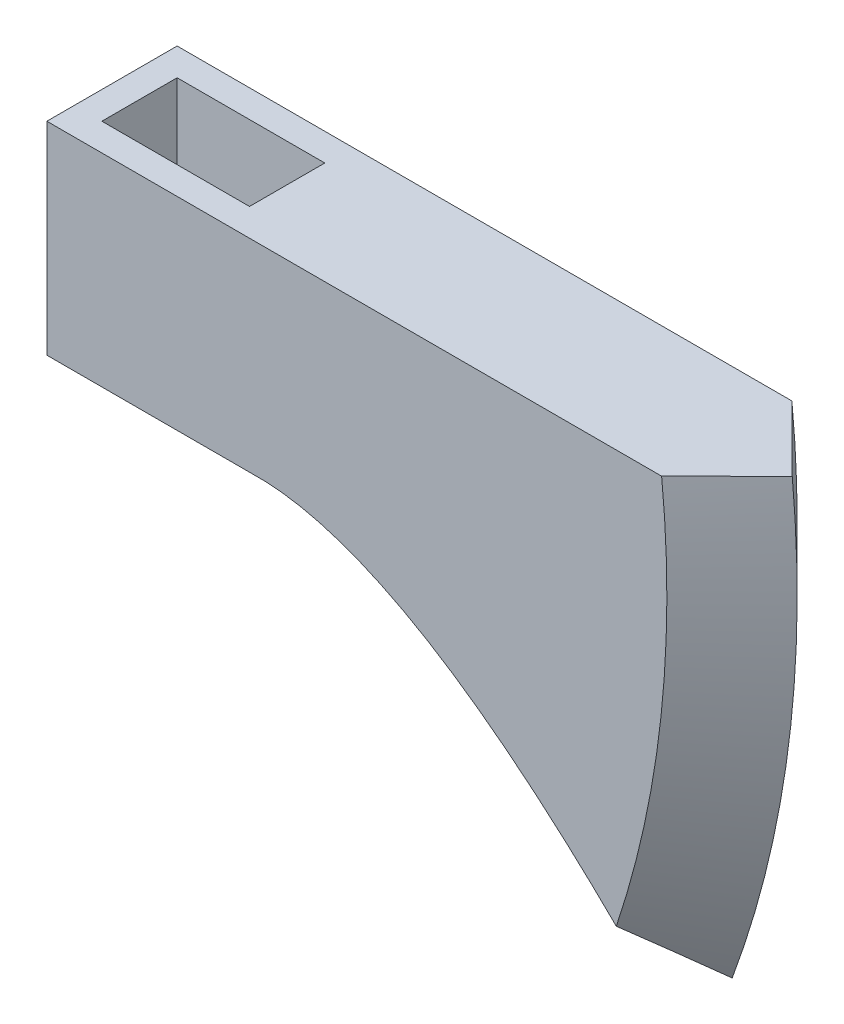
ISO-10303-21;
HEADER;
FILE_DESCRIPTION(('STEP AP214'),'2;1');
FILE_NAME('part.step','',(''),(''),'','','');
FILE_SCHEMA(('AUTOMOTIVE_DESIGN { 1 0 10303 214 1 1 1 1 }'));
ENDSEC;
DATA;
#1=APPLICATION_CONTEXT('core data for automotive mechanical design processes');
#2=APPLICATION_PROTOCOL_DEFINITION('international standard','automotive_design',2000,#1);
#3=PRODUCT_CONTEXT('',#1,'mechanical');
#4=PRODUCT('Part','Part','',(#3));
#5=PRODUCT_RELATED_PRODUCT_CATEGORY('part','',(#4));
#6=PRODUCT_DEFINITION_FORMATION('','',#4);
#7=PRODUCT_DEFINITION_CONTEXT('part definition',#1,'design');
#8=PRODUCT_DEFINITION('design','',#6,#7);
#9=PRODUCT_DEFINITION_SHAPE('','',#8);
#10=(LENGTH_UNIT() NAMED_UNIT(*) SI_UNIT(.MILLI.,.METRE.));
#11=(NAMED_UNIT(*) PLANE_ANGLE_UNIT() SI_UNIT($,.RADIAN.));
#12=(NAMED_UNIT(*) SI_UNIT($,.STERADIAN.) SOLID_ANGLE_UNIT());
#13=UNCERTAINTY_MEASURE_WITH_UNIT(LENGTH_MEASURE(1.E-05),#10,'distance_accuracy_value','');
#14=(GEOMETRIC_REPRESENTATION_CONTEXT(3) GLOBAL_UNCERTAINTY_ASSIGNED_CONTEXT((#13)) GLOBAL_UNIT_ASSIGNED_CONTEXT((#10,
#11,#12)) REPRESENTATION_CONTEXT('',''));
#15=CARTESIAN_POINT('',(0.,0.,0.));
#16=DIRECTION('',(0.,0.,1.));
#17=DIRECTION('',(1.,0.,0.));
#18=AXIS2_PLACEMENT_3D('',#15,#16,#17);
#19=CARTESIAN_POINT('',(-34.1369863013698,-14.,9.));
#20=DIRECTION('',(1.,0.,0.));
#21=DIRECTION('',(0.,1.,0.));
#22=AXIS2_PLACEMENT_3D('',#19,#20,#21);
#23=PLANE('',#22);
#24=DIRECTION('',(0.,-1.,0.));
#25=VECTOR('',#24,1.);
#26=CARTESIAN_POINT('',(-34.1369863013698,-14.,0.));
#27=LINE('',#26,#25);
#28=CARTESIAN_POINT('',(-34.1369863013698,-14.,0.));
#29=VERTEX_POINT('',#28);
#30=CARTESIAN_POINT('',(-34.1369863013698,-28.,0.));
#31=VERTEX_POINT('',#30);
#32=EDGE_CURVE('E188',#29,#31,#27,.T.);
#33=ORIENTED_EDGE('',*,*,#32,.T.);
#34=DIRECTION('',(0.,0.,-1.));
#35=VECTOR('',#34,1.);
#36=CARTESIAN_POINT('',(-34.1369863013698,-28.,9.));
#37=LINE('',#36,#35);
#38=CARTESIAN_POINT('',(-34.1369863013698,-28.,9.));
#39=VERTEX_POINT('',#38);
#40=EDGE_CURVE('E208',#39,#31,#37,.T.);
#41=ORIENTED_EDGE('',*,*,#40,.F.);
#42=DIRECTION('',(0.,-1.,0.));
#43=VECTOR('',#42,1.);
#44=CARTESIAN_POINT('',(-34.1369863013698,-14.,9.));
#45=LINE('',#44,#43);
#46=CARTESIAN_POINT('',(-34.1369863013698,-14.,9.));
#47=VERTEX_POINT('',#46);
#48=EDGE_CURVE('E216',#47,#39,#45,.T.);
#49=ORIENTED_EDGE('',*,*,#48,.F.);
#50=DIRECTION('',(0.,0.,-1.));
#51=VECTOR('',#50,1.);
#52=CARTESIAN_POINT('',(-34.1369863013698,-14.,9.));
#53=LINE('',#52,#51);
#54=EDGE_CURVE('E128',#47,#29,#53,.T.);
#55=ORIENTED_EDGE('',*,*,#54,.T.);
#56=EDGE_LOOP('',(#33,#41,#49,#55));
#57=FACE_BOUND('',#56,.T.);
#58=ADVANCED_FACE('F40',(#57),#23,.F.);
#59=CARTESIAN_POINT('',(-34.1369863013698,-28.,9.));
#60=DIRECTION('',(0.,1.,0.));
#61=DIRECTION('',(0.,0.,1.));
#62=AXIS2_PLACEMENT_3D('',#59,#60,#61);
#63=PLANE('',#62);
#64=DIRECTION('',(-1.,0.,0.));
#65=VECTOR('',#64,1.);
#66=CARTESIAN_POINT('',(-34.1369863013698,-28.,1.9));
#67=LINE('',#66,#65);
#68=CARTESIAN_POINT('',(-22.0369863013698,-28.,1.9));
#69=VERTEX_POINT('',#68);
#70=CARTESIAN_POINT('',(-32.2369863013698,-28.,1.9));
#71=VERTEX_POINT('',#70);
#72=EDGE_CURVE('E261',#69,#71,#67,.T.);
#73=ORIENTED_EDGE('',*,*,#72,.T.);
#74=DIRECTION('',(0.,0.,1.));
#75=VECTOR('',#74,1.);
#76=CARTESIAN_POINT('',(-32.2369863013698,-28.,9.));
#77=LINE('',#76,#75);
#78=CARTESIAN_POINT('',(-32.2369863013698,-28.,7.1));
#79=VERTEX_POINT('',#78);
#80=EDGE_CURVE('E194',#71,#79,#77,.T.);
#81=ORIENTED_EDGE('',*,*,#80,.T.);
#82=DIRECTION('',(1.,0.,0.));
#83=VECTOR('',#82,1.);
#84=CARTESIAN_POINT('',(-34.1369863013698,-28.,7.1));
#85=LINE('',#84,#83);
#86=CARTESIAN_POINT('',(-22.0369863013698,-28.,7.1));
#87=VERTEX_POINT('',#86);
#88=EDGE_CURVE('E266',#79,#87,#85,.T.);
#89=ORIENTED_EDGE('',*,*,#88,.T.);
#90=DIRECTION('',(0.,0.,-1.));
#91=VECTOR('',#90,1.);
#92=CARTESIAN_POINT('',(-22.0369863013698,-28.,9.));
#93=LINE('',#92,#91);
#94=EDGE_CURVE('E135',#87,#69,#93,.T.);
#95=ORIENTED_EDGE('',*,*,#94,.T.);
#96=EDGE_LOOP('',(#73,#81,#89,#95));
#97=FACE_BOUND('',#96,.T.);
#98=DIRECTION('',(1.,0.,0.));
#99=VECTOR('',#98,1.);
#100=CARTESIAN_POINT('',(-34.1369863013698,-28.,0.));
#101=LINE('',#100,#99);
#102=CARTESIAN_POINT('',(-20.1369863013698,-28.,0.));
#103=VERTEX_POINT('',#102);
#104=EDGE_CURVE('E193',#31,#103,#101,.T.);
#105=ORIENTED_EDGE('',*,*,#104,.T.);
#106=DIRECTION('',(0.,0.,-1.));
#107=VECTOR('',#106,1.);
#108=CARTESIAN_POINT('',(-20.1369863013698,-28.,9.));
#109=LINE('',#108,#107);
#110=CARTESIAN_POINT('',(-20.1369863013698,-28.,9.));
#111=VERTEX_POINT('',#110);
#112=EDGE_CURVE('E185',#111,#103,#109,.T.);
#113=ORIENTED_EDGE('',*,*,#112,.F.);
#114=DIRECTION('',(1.,0.,0.));
#115=VECTOR('',#114,1.);
#116=CARTESIAN_POINT('',(-34.1369863013698,-28.,9.));
#117=LINE('',#116,#115);
#118=EDGE_CURVE('E186',#39,#111,#117,.T.);
#119=ORIENTED_EDGE('',*,*,#118,.F.);
#120=ORIENTED_EDGE('',*,*,#40,.T.);
#121=EDGE_LOOP('',(#105,#113,#119,#120));
#122=FACE_BOUND('',#121,.T.);
#123=ADVANCED_FACE('F175',(#97,#122),#63,.F.);
#124=CARTESIAN_POINT('',(-20.1369863013698,-28.,9.));
#125=CARTESIAN_POINT('',(-8.57754467754687,-27.5827571257103,9.));
#126=CARTESIAN_POINT('',(9.09151862111341,-46.4948701036733,9.));
#127=B_SPLINE_CURVE_WITH_KNOTS('',2,(#124,#125,#126),.UNSPECIFIED.,.F.,.F.,(3,3),(0.,1.),.UNSPECIFIED.);
#128=DIRECTION('',(0.,0.,-1.));
#129=VECTOR('',#128,1.);
#130=SURFACE_OF_LINEAR_EXTRUSION('',#127,#129);
#131=CARTESIAN_POINT('',(-20.1369863013698,-28.,0.));
#132=CARTESIAN_POINT('',(-8.57754467754687,-27.5827571257103,0.));
#133=CARTESIAN_POINT('',(9.09151862111341,-46.4948701036733,0.));
#134=B_SPLINE_CURVE_WITH_KNOTS('',2,(#131,#132,#133),.UNSPECIFIED.,.F.,.F.,(3,3),(0.,1.),.UNSPECIFIED.);
#135=CARTESIAN_POINT('',(5.20330146390259,-42.494136438475,0.));
#136=VERTEX_POINT('',#135);
#137=EDGE_CURVE('E196',#103,#136,#134,.T.);
#138=ORIENTED_EDGE('',*,*,#137,.T.);
#139=CARTESIAN_POINT('',(5.20330146390272,-42.4941364384748,0.));
#140=CARTESIAN_POINT('',(5.36872680943576,-42.6572218572216,0.20855075810476));
#141=CARTESIAN_POINT('',(5.53370221831308,-42.8208095757631,0.417065326718535));
#142=CARTESIAN_POINT('',(5.86276399961041,-43.1489429115123,0.834020679713435));
#143=CARTESIAN_POINT('',(6.02685041278599,-43.3134884840778,1.04246146706046));
#144=CARTESIAN_POINT('',(6.35415559673947,-43.6435011392242,1.45928110383902));
#145=CARTESIAN_POINT('',(6.51737439249722,-43.8089681949905,1.6676599548889));
#146=CARTESIAN_POINT('',(6.84296477768484,-44.1407898213802,2.08436663882076));
#147=CARTESIAN_POINT('',(7.00533637829413,-44.3071443802333,2.2926944723412));
#148=CARTESIAN_POINT('',(7.32925135743088,-44.6407078225895,2.70930841482869));
#149=CARTESIAN_POINT('',(7.49079473873783,-44.8079167032217,2.9175945239335));
#150=CARTESIAN_POINT('',(7.81307325056096,-45.1431590449371,3.33413583186656));
#151=CARTESIAN_POINT('',(7.97380836817467,-45.3111925190994,3.5423910301502));
#152=CARTESIAN_POINT('',(8.29448890616631,-45.6480549337294,3.95887975490476));
#153=CARTESIAN_POINT('',(8.45443430318623,-45.8168838974406,4.16711328055844));
#154=CARTESIAN_POINT('',(8.77355316179401,-46.1553099754242,4.58356718531641));
#155=CARTESIAN_POINT('',(8.93272659087685,-46.3249071214708,4.79178756350893));
#156=CARTESIAN_POINT('',(9.09151862111341,-46.4948701036733,5.));
#157=B_SPLINE_CURVE_WITH_KNOTS('',3,(#139,#140,#141,#142,#143,#144,#145,#146,#147,#148,#149,
#150,#151,#152,#153,#154,#155,#156),.UNSPECIFIED.,.F.,.F.,(4,2,2,2,2,2,2,2,4),(0.,
0.936536415336516,1.8730295260025,2.80949552614946,3.7459491374599,4.68239960398278,
5.61886497209713,6.55535787460602,7.49188987320832),.UNSPECIFIED.);
#158=CARTESIAN_POINT('',(8.70947212242241,-46.087446479258,4.50000000000881));
#159=VERTEX_POINT('',#158);
#160=EDGE_CURVE('E51',#136,#159,#157,.T.);
#161=ORIENTED_EDGE('',*,*,#160,.T.);
#162=CARTESIAN_POINT('',(9.09151862111341,-46.4948701036733,3.99999999999999));
#163=CARTESIAN_POINT('',(8.93272659087685,-46.3249071214708,4.20821243649105));
#164=CARTESIAN_POINT('',(8.77355316179401,-46.1553099754242,4.41643281468358));
#165=CARTESIAN_POINT('',(8.45443430318624,-45.8168838974406,4.83288671944155));
#166=CARTESIAN_POINT('',(8.29448890616631,-45.6480549337294,5.04112024509523));
#167=CARTESIAN_POINT('',(7.97380836817467,-45.3111925190994,5.45760896984979));
#168=CARTESIAN_POINT('',(7.81307325056096,-45.1431590449371,5.66586416813342));
#169=CARTESIAN_POINT('',(7.49079473873783,-44.8079167032217,6.08240547606649));
#170=CARTESIAN_POINT('',(7.32925135743088,-44.6407078225895,6.29069158517131));
#171=CARTESIAN_POINT('',(7.00533637829414,-44.3071443802333,6.70730552765879));
#172=CARTESIAN_POINT('',(6.84296477768484,-44.1407898213802,6.91563336117922));
#173=CARTESIAN_POINT('',(6.51737439249721,-43.8089681949905,7.33234004511107));
#174=CARTESIAN_POINT('',(6.35415559673947,-43.6435011392242,7.54071889616096));
#175=CARTESIAN_POINT('',(6.026850412786,-43.3134884840777,7.95753853293952));
#176=CARTESIAN_POINT('',(5.86276399961042,-43.1489429115123,8.16597932028654));
#177=CARTESIAN_POINT('',(5.53370221831307,-42.8208095757632,8.58293467328145));
#178=CARTESIAN_POINT('',(5.36872680943571,-42.6572218572217,8.79144924189524));
#179=CARTESIAN_POINT('',(5.20330146390259,-42.494136438475,9.00000000000004));
#180=B_SPLINE_CURVE_WITH_KNOTS('',3,(#162,#163,#164,#165,#166,#167,#168,#169,#170,#171,#172,
#173,#174,#175,#176,#177,#178,#179),.UNSPECIFIED.,.F.,.F.,(4,2,2,2,2,2,2,2,4),(0.,
0.936531998602297,1.87302490111118,2.80949026922554,3.74594073574841,4.68239434705886,
5.61886034720581,6.55535345787179,7.49188987320831),.UNSPECIFIED.);
#181=CARTESIAN_POINT('',(5.2033014639026,-42.494136438475,9.));
#182=VERTEX_POINT('',#181);
#183=EDGE_CURVE('E61',#159,#182,#180,.T.);
#184=ORIENTED_EDGE('',*,*,#183,.T.);
#185=EDGE_CURVE('E179',#111,#182,#127,.T.);
#186=ORIENTED_EDGE('',*,*,#185,.F.);
#187=ORIENTED_EDGE('',*,*,#112,.T.);
#188=EDGE_LOOP('',(#138,#161,#184,#186,#187));
#189=FACE_BOUND('',#188,.T.);
#190=ADVANCED_FACE('F167',(#189),#130,.F.);
#191=CARTESIAN_POINT('',(-20.1369863013698,-14.,9.));
#192=DIRECTION('',(0.,-1.,0.));
#193=DIRECTION('',(0.,0.,-1.));
#194=AXIS2_PLACEMENT_3D('',#191,#192,#193);
#195=PLANE('',#194);
#196=DIRECTION('',(-1.,0.,0.));
#197=VECTOR('',#196,1.);
#198=CARTESIAN_POINT('',(-20.1369863013698,-14.,7.1));
#199=LINE('',#198,#197);
#200=CARTESIAN_POINT('',(-22.0369863013698,-14.,7.1));
#201=VERTEX_POINT('',#200);
#202=CARTESIAN_POINT('',(-32.2369863013698,-14.,7.1));
#203=VERTEX_POINT('',#202);
#204=EDGE_CURVE('E116',#201,#203,#199,.T.);
#205=ORIENTED_EDGE('',*,*,#204,.T.);
#206=DIRECTION('',(0.,0.,-1.));
#207=VECTOR('',#206,1.);
#208=CARTESIAN_POINT('',(-32.2369863013698,-14.,9.));
#209=LINE('',#208,#207);
#210=CARTESIAN_POINT('',(-32.2369863013698,-14.,1.9));
#211=VERTEX_POINT('',#210);
#212=EDGE_CURVE('E144',#203,#211,#209,.T.);
#213=ORIENTED_EDGE('',*,*,#212,.T.);
#214=DIRECTION('',(1.,0.,0.));
#215=VECTOR('',#214,1.);
#216=CARTESIAN_POINT('',(-20.1369863013698,-14.,1.9));
#217=LINE('',#216,#215);
#218=CARTESIAN_POINT('',(-22.0369863013698,-14.,1.9));
#219=VERTEX_POINT('',#218);
#220=EDGE_CURVE('E142',#211,#219,#217,.T.);
#221=ORIENTED_EDGE('',*,*,#220,.T.);
#222=DIRECTION('',(0.,0.,1.));
#223=VECTOR('',#222,1.);
#224=CARTESIAN_POINT('',(-22.0369863013698,-14.,9.));
#225=LINE('',#224,#223);
#226=EDGE_CURVE('E127',#219,#201,#225,.T.);
#227=ORIENTED_EDGE('',*,*,#226,.T.);
#228=EDGE_LOOP('',(#205,#213,#221,#227));
#229=FACE_BOUND('',#228,.T.);
#230=CARTESIAN_POINT('',(8.33403323451083,-14.,9.));
#231=CARTESIAN_POINT('',(9.17167185692276,-14.,8.16681543099034));
#232=CARTESIAN_POINT('',(10.0092364662861,-14.,7.33355647970208));
#233=CARTESIAN_POINT('',(11.6842176584464,-14.,5.66688981303532));
#234=CARTESIAN_POINT('',(12.5216342412434,-14.,4.83348209765691));
#235=CARTESIAN_POINT('',(13.3589768109919,-14.,3.99999999999999));
#236=B_SPLINE_CURVE_WITH_KNOTS('',3,(#230,#231,#232,#233,#234,#235),.UNSPECIFIED.,.F.,.F.,(4,2,
4),(0.,3.544363778288,7.08872755458989),.UNSPECIFIED.);
#237=CARTESIAN_POINT('',(8.33403323451083,-14.,9.));
#238=VERTEX_POINT('',#237);
#239=CARTESIAN_POINT('',(12.8566386385213,-14.,4.50000000000001));
#240=VERTEX_POINT('',#239);
#241=EDGE_CURVE('E149',#238,#240,#236,.T.);
#242=ORIENTED_EDGE('',*,*,#241,.T.);
#243=CARTESIAN_POINT('',(13.3589768109919,-14.,5.));
#244=CARTESIAN_POINT('',(12.5216342412434,-14.,4.16651790234308));
#245=CARTESIAN_POINT('',(11.6842176584464,-14.,3.33311018696467));
#246=CARTESIAN_POINT('',(10.0092364662861,-14.,1.66644352029792));
#247=CARTESIAN_POINT('',(9.17167185692277,-14.,0.833184569009659));
#248=CARTESIAN_POINT('',(8.33403323451085,-14.,0.));
#249=B_SPLINE_CURVE_WITH_KNOTS('',3,(#243,#244,#245,#246,#247,#248),.UNSPECIFIED.,.F.,.F.,(4,2,
4),(0.,3.54436377630188,7.08872755458987),.UNSPECIFIED.);
#250=CARTESIAN_POINT('',(8.33403323451085,-14.,0.));
#251=VERTEX_POINT('',#250);
#252=EDGE_CURVE('E156',#240,#251,#249,.T.);
#253=ORIENTED_EDGE('',*,*,#252,.T.);
#254=DIRECTION('',(-1.,0.,0.));
#255=VECTOR('',#254,1.);
#256=CARTESIAN_POINT('',(-20.1369863013698,-14.,0.));
#257=LINE('',#256,#255);
#258=EDGE_CURVE('E200',#251,#29,#257,.T.);
#259=ORIENTED_EDGE('',*,*,#258,.T.);
#260=ORIENTED_EDGE('',*,*,#54,.F.);
#261=DIRECTION('',(-1.,0.,0.));
#262=VECTOR('',#261,1.);
#263=CARTESIAN_POINT('',(-34.1369863013698,-14.,9.));
#264=LINE('',#263,#262);
#265=EDGE_CURVE('E205',#238,#47,#264,.T.);
#266=ORIENTED_EDGE('',*,*,#265,.F.);
#267=EDGE_LOOP('',(#242,#253,#259,#260,#266));
#268=FACE_BOUND('',#267,.T.);
#269=ADVANCED_FACE('F140',(#229,#268),#195,.F.);
#270=CARTESIAN_POINT('',(-59.1900176319002,-21.,9.));
#271=DIRECTION('',(0.,0.,-1.));
#272=DIRECTION('',(-1.,0.,0.));
#273=AXIS2_PLACEMENT_3D('',#270,#271,#272);
#274=PLANE('',#273);
#275=ORIENTED_EDGE('',*,*,#185,.T.);
#276=CARTESIAN_POINT('',(-59.1900176319002,-21.,9.));
#277=DIRECTION('',(0.,0.,-1.));
#278=DIRECTION('',(-1.,0.,0.));
#279=AXIS2_PLACEMENT_3D('',#276,#277,#278);
#280=CIRCLE('',#279,67.8859149265123);
#281=EDGE_CURVE('E11',#182,#238,#280,.F.);
#282=ORIENTED_EDGE('',*,*,#281,.T.);
#283=ORIENTED_EDGE('',*,*,#265,.T.);
#284=ORIENTED_EDGE('',*,*,#48,.T.);
#285=ORIENTED_EDGE('',*,*,#118,.T.);
#286=EDGE_LOOP('',(#275,#282,#283,#284,#285));
#287=FACE_BOUND('',#286,.T.);
#288=ADVANCED_FACE('F166',(#287),#274,.F.);
#289=CARTESIAN_POINT('',(-59.1900176319002,-21.,0.));
#290=DIRECTION('',(0.,0.,-1.));
#291=DIRECTION('',(-1.,0.,0.));
#292=AXIS2_PLACEMENT_3D('',#289,#290,#291);
#293=PLANE('',#292);
#294=ORIENTED_EDGE('',*,*,#258,.F.);
#295=CARTESIAN_POINT('',(-59.1900176319002,-21.,0.));
#296=DIRECTION('',(0.,0.,-1.));
#297=DIRECTION('',(-1.,0.,0.));
#298=AXIS2_PLACEMENT_3D('',#295,#296,#297);
#299=CIRCLE('',#298,67.8859149265123);
#300=EDGE_CURVE('E236',#251,#136,#299,.T.);
#301=ORIENTED_EDGE('',*,*,#300,.T.);
#302=ORIENTED_EDGE('',*,*,#137,.F.);
#303=ORIENTED_EDGE('',*,*,#104,.F.);
#304=ORIENTED_EDGE('',*,*,#32,.F.);
#305=EDGE_LOOP('',(#294,#301,#302,#303,#304));
#306=FACE_BOUND('',#305,.T.);
#307=ADVANCED_FACE('F168',(#306),#293,.T.);
#308=CARTESIAN_POINT('',(-32.2369863013698,-46.4948701036733,1.9));
#309=DIRECTION('',(-1.,0.,0.));
#310=DIRECTION('',(0.,0.,1.));
#311=AXIS2_PLACEMENT_3D('',#308,#309,#310);
#312=PLANE('',#311);
#313=DIRECTION('',(0.,1.,0.));
#314=VECTOR('',#313,1.);
#315=CARTESIAN_POINT('',(-32.2369863013698,-46.4948701036733,1.9));
#316=LINE('',#315,#314);
#317=EDGE_CURVE('E271',#71,#211,#316,.T.);
#318=ORIENTED_EDGE('',*,*,#317,.T.);
#319=ORIENTED_EDGE('',*,*,#212,.F.);
#320=DIRECTION('',(0.,1.,0.));
#321=VECTOR('',#320,1.);
#322=CARTESIAN_POINT('',(-32.2369863013698,-46.4948701036733,7.1));
#323=LINE('',#322,#321);
#324=EDGE_CURVE('E122',#79,#203,#323,.T.);
#325=ORIENTED_EDGE('',*,*,#324,.F.);
#326=ORIENTED_EDGE('',*,*,#80,.F.);
#327=EDGE_LOOP('',(#318,#319,#325,#326));
#328=FACE_BOUND('',#327,.T.);
#329=ADVANCED_FACE('F276',(#328),#312,.F.);
#330=CARTESIAN_POINT('',(-32.2369863013698,-46.4948701036733,1.9));
#331=DIRECTION('',(0.,0.,-1.));
#332=DIRECTION('',(-1.,0.,0.));
#333=AXIS2_PLACEMENT_3D('',#330,#331,#332);
#334=PLANE('',#333);
#335=DIRECTION('',(0.,1.,0.));
#336=VECTOR('',#335,1.);
#337=CARTESIAN_POINT('',(-22.0369863013698,-46.4948701036733,1.9));
#338=LINE('',#337,#336);
#339=EDGE_CURVE('E137',#69,#219,#338,.T.);
#340=ORIENTED_EDGE('',*,*,#339,.T.);
#341=ORIENTED_EDGE('',*,*,#220,.F.);
#342=ORIENTED_EDGE('',*,*,#317,.F.);
#343=ORIENTED_EDGE('',*,*,#72,.F.);
#344=EDGE_LOOP('',(#340,#341,#342,#343));
#345=FACE_BOUND('',#344,.T.);
#346=ADVANCED_FACE('F277',(#345),#334,.F.);
#347=CARTESIAN_POINT('',(-22.0369863013698,-46.4948701036733,1.9));
#348=DIRECTION('',(1.,0.,0.));
#349=DIRECTION('',(0.,0.,-1.));
#350=AXIS2_PLACEMENT_3D('',#347,#348,#349);
#351=PLANE('',#350);
#352=DIRECTION('',(0.,1.,0.));
#353=VECTOR('',#352,1.);
#354=CARTESIAN_POINT('',(-22.0369863013698,-46.4948701036733,7.1));
#355=LINE('',#354,#353);
#356=EDGE_CURVE('E119',#87,#201,#355,.T.);
#357=ORIENTED_EDGE('',*,*,#356,.T.);
#358=ORIENTED_EDGE('',*,*,#226,.F.);
#359=ORIENTED_EDGE('',*,*,#339,.F.);
#360=ORIENTED_EDGE('',*,*,#94,.F.);
#361=EDGE_LOOP('',(#357,#358,#359,#360));
#362=FACE_BOUND('',#361,.T.);
#363=ADVANCED_FACE('F131',(#362),#351,.F.);
#364=CARTESIAN_POINT('',(-32.2369863013698,-46.4948701036733,7.1));
#365=DIRECTION('',(0.,0.,1.));
#366=DIRECTION('',(1.,0.,0.));
#367=AXIS2_PLACEMENT_3D('',#364,#365,#366);
#368=PLANE('',#367);
#369=ORIENTED_EDGE('',*,*,#324,.T.);
#370=ORIENTED_EDGE('',*,*,#204,.F.);
#371=ORIENTED_EDGE('',*,*,#356,.F.);
#372=ORIENTED_EDGE('',*,*,#88,.F.);
#373=EDGE_LOOP('',(#369,#370,#371,#372));
#374=FACE_BOUND('',#373,.T.);
#375=ADVANCED_FACE('F118',(#374),#368,.F.);
#376=CARTESIAN_POINT('',(-59.1900176319002,-21.,9.));
#377=DIRECTION('',(0.,0.,-1.));
#378=DIRECTION('',(-1.,0.,0.));
#379=AXIS2_PLACEMENT_3D('',#376,#377,#378);
#380=CONICAL_SURFACE('',#379,67.8859149265123,0.785398163397448);
#381=ORIENTED_EDGE('',*,*,#281,.F.);
#382=ORIENTED_EDGE('',*,*,#183,.F.);
#383=CARTESIAN_POINT('',(-59.1900176319002,-21.,4.5));
#384=DIRECTION('',(0.,0.,-1.));
#385=DIRECTION('',(-1.,0.,0.));
#386=AXIS2_PLACEMENT_3D('',#383,#384,#385);
#387=CIRCLE('',#386,72.3859149265123);
#388=EDGE_CURVE('E46',#240,#159,#387,.T.);
#389=ORIENTED_EDGE('',*,*,#388,.F.);
#390=ORIENTED_EDGE('',*,*,#241,.F.);
#391=EDGE_LOOP('',(#381,#382,#389,#390));
#392=FACE_BOUND('',#391,.T.);
#393=ADVANCED_FACE('F43',(#392),#380,.T.);
#394=CARTESIAN_POINT('',(-59.1900176319002,-21.,5.));
#395=DIRECTION('',(0.,0.,1.));
#396=DIRECTION('',(1.,0.,0.));
#397=AXIS2_PLACEMENT_3D('',#394,#395,#396);
#398=CONICAL_SURFACE('',#397,72.8859149265123,0.785398163397447);
#399=ORIENTED_EDGE('',*,*,#160,.F.);
#400=ORIENTED_EDGE('',*,*,#300,.F.);
#401=ORIENTED_EDGE('',*,*,#252,.F.);
#402=ORIENTED_EDGE('',*,*,#388,.T.);
#403=EDGE_LOOP('',(#399,#400,#401,#402));
#404=FACE_BOUND('',#403,.T.);
#405=ADVANCED_FACE('F235',(#404),#398,.T.);
#406=CLOSED_SHELL('',(#58,#123,#190,#269,#288,#307,#329,#346,#363,#375,#393,#405));
#407=MANIFOLD_SOLID_BREP('B2',#406);
#408=ADVANCED_BREP_SHAPE_REPRESENTATION('',(#18,#407),#14);
#409=SHAPE_DEFINITION_REPRESENTATION(#9,#408);
ENDSEC;
END-ISO-10303-21;
